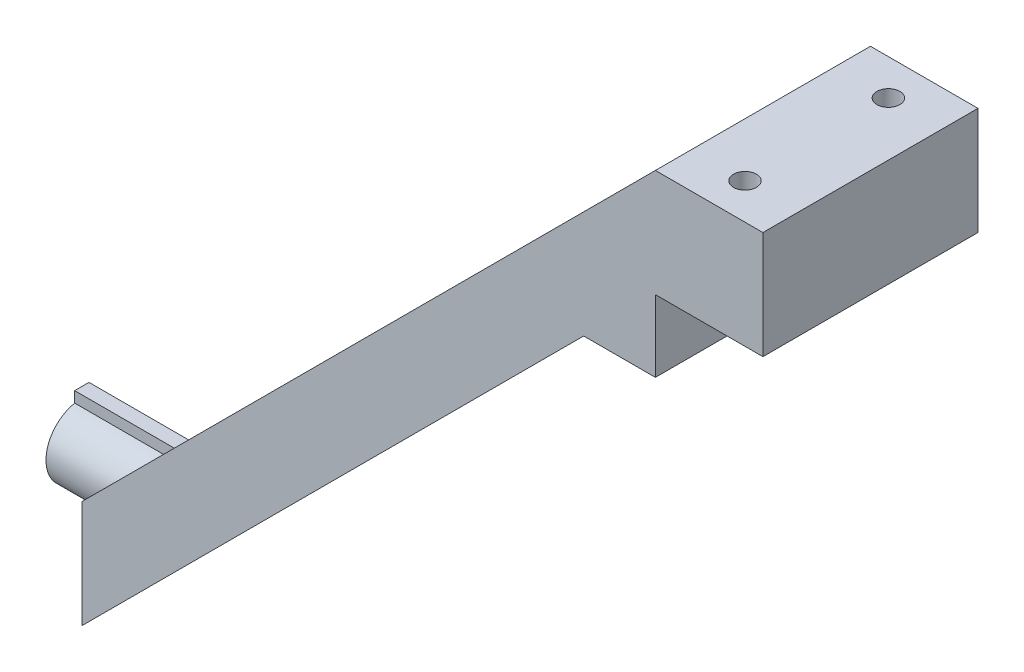
ISO-10303-21;
HEADER;
FILE_DESCRIPTION(('STEP AP214'),'2;1');
FILE_NAME('part.step','',(''),(''),'','','');
FILE_SCHEMA(('AUTOMOTIVE_DESIGN { 1 0 10303 214 1 1 1 1 }'));
ENDSEC;
DATA;
#1=APPLICATION_CONTEXT('core data for automotive mechanical design processes');
#2=APPLICATION_PROTOCOL_DEFINITION('international standard','automotive_design',2000,#1);
#3=PRODUCT_CONTEXT('',#1,'mechanical');
#4=PRODUCT('Part','Part','',(#3));
#5=PRODUCT_RELATED_PRODUCT_CATEGORY('part','',(#4));
#6=PRODUCT_DEFINITION_FORMATION('','',#4);
#7=PRODUCT_DEFINITION_CONTEXT('part definition',#1,'design');
#8=PRODUCT_DEFINITION('design','',#6,#7);
#9=PRODUCT_DEFINITION_SHAPE('','',#8);
#10=(LENGTH_UNIT() NAMED_UNIT(*) SI_UNIT(.MILLI.,.METRE.));
#11=(NAMED_UNIT(*) PLANE_ANGLE_UNIT() SI_UNIT($,.RADIAN.));
#12=(NAMED_UNIT(*) SI_UNIT($,.STERADIAN.) SOLID_ANGLE_UNIT());
#13=UNCERTAINTY_MEASURE_WITH_UNIT(LENGTH_MEASURE(1.E-05),#10,'distance_accuracy_value','');
#14=(GEOMETRIC_REPRESENTATION_CONTEXT(3) GLOBAL_UNCERTAINTY_ASSIGNED_CONTEXT((#13)) GLOBAL_UNIT_ASSIGNED_CONTEXT((#10,
#11,#12)) REPRESENTATION_CONTEXT('',''));
#15=CARTESIAN_POINT('',(0.,0.,0.));
#16=DIRECTION('',(0.,0.,1.));
#17=DIRECTION('',(1.,0.,0.));
#18=AXIS2_PLACEMENT_3D('',#15,#16,#17);
#19=CARTESIAN_POINT('',(-79.9999999999997,-80.,30.));
#20=DIRECTION('',(1.,0.,0.));
#21=DIRECTION('',(0.,0.,-1.));
#22=AXIS2_PLACEMENT_3D('',#19,#20,#21);
#23=PLANE('',#22);
#24=DIRECTION('',(0.,-1.,0.));
#25=VECTOR('',#24,1.);
#26=CARTESIAN_POINT('',(-79.9999999999997,-80.,0.));
#27=LINE('',#26,#25);
#28=CARTESIAN_POINT('',(-79.9999999999997,-80.,0.));
#29=VERTEX_POINT('',#28);
#30=CARTESIAN_POINT('',(-79.9999999999997,-95.,0.));
#31=VERTEX_POINT('',#30);
#32=EDGE_CURVE('E206',#29,#31,#27,.T.);
#33=ORIENTED_EDGE('',*,*,#32,.T.);
#34=DIRECTION('',(0.,0.,-1.));
#35=VECTOR('',#34,1.);
#36=CARTESIAN_POINT('',(-79.9999999999997,-95.,30.));
#37=LINE('',#36,#35);
#38=CARTESIAN_POINT('',(-79.9999999999997,-95.,30.));
#39=VERTEX_POINT('',#38);
#40=EDGE_CURVE('E55',#39,#31,#37,.T.);
#41=ORIENTED_EDGE('',*,*,#40,.F.);
#42=DIRECTION('',(0.,-1.,0.));
#43=VECTOR('',#42,1.);
#44=CARTESIAN_POINT('',(-79.9999999999997,-80.,30.));
#45=LINE('',#44,#43);
#46=CARTESIAN_POINT('',(-79.9999999999997,-80.,30.));
#47=VERTEX_POINT('',#46);
#48=EDGE_CURVE('E179',#47,#39,#45,.T.);
#49=ORIENTED_EDGE('',*,*,#48,.F.);
#50=DIRECTION('',(0.,0.,-1.));
#51=VECTOR('',#50,1.);
#52=CARTESIAN_POINT('',(-79.9999999999997,-80.,30.));
#53=LINE('',#52,#51);
#54=EDGE_CURVE('E11',#47,#29,#53,.T.);
#55=ORIENTED_EDGE('',*,*,#54,.T.);
#56=EDGE_LOOP('',(#33,#41,#49,#55));
#57=FACE_BOUND('',#56,.T.);
#58=CARTESIAN_POINT('',(-79.9999999999997,-87.5,15.));
#59=DIRECTION('',(-1.,0.,0.));
#60=DIRECTION('',(0.,0.,1.));
#61=AXIS2_PLACEMENT_3D('',#58,#59,#60);
#62=CIRCLE('',#61,5.00000000000001);
#63=CARTESIAN_POINT('',(-79.9999999999997,-82.6010205144336,14.));
#64=VERTEX_POINT('',#63);
#65=CARTESIAN_POINT('',(-79.9999999999997,-82.6010205144336,16.));
#66=VERTEX_POINT('',#65);
#67=EDGE_CURVE('E63',#64,#66,#62,.T.);
#68=ORIENTED_EDGE('',*,*,#67,.F.);
#69=DIRECTION('',(0.,-1.,0.));
#70=VECTOR('',#69,1.);
#71=CARTESIAN_POINT('',(-79.9999999999997,-82.6010205144336,14.));
#72=LINE('',#71,#70);
#73=CARTESIAN_POINT('',(-79.9999999999997,-81.1010205144337,14.));
#74=VERTEX_POINT('',#73);
#75=EDGE_CURVE('E67',#74,#64,#72,.T.);
#76=ORIENTED_EDGE('',*,*,#75,.F.);
#77=DIRECTION('',(0.,0.,-1.));
#78=VECTOR('',#77,1.);
#79=CARTESIAN_POINT('',(-79.9999999999997,-81.1010205144337,14.));
#80=LINE('',#79,#78);
#81=CARTESIAN_POINT('',(-79.9999999999997,-81.1010205144337,16.));
#82=VERTEX_POINT('',#81);
#83=EDGE_CURVE('E416',#82,#74,#80,.T.);
#84=ORIENTED_EDGE('',*,*,#83,.F.);
#85=DIRECTION('',(0.,1.,0.));
#86=VECTOR('',#85,1.);
#87=CARTESIAN_POINT('',(-79.9999999999997,-82.6010205144336,16.));
#88=LINE('',#87,#86);
#89=EDGE_CURVE('E426',#66,#82,#88,.T.);
#90=ORIENTED_EDGE('',*,*,#89,.F.);
#91=EDGE_LOOP('',(#68,#76,#84,#90));
#92=FACE_BOUND('',#91,.T.);
#93=ADVANCED_FACE('F45',(#57,#92),#23,.F.);
#94=CARTESIAN_POINT('',(0.,0.,30.));
#95=DIRECTION('',(0.707106781186549,-0.707106781186546,0.));
#96=DIRECTION('',(0.707106781186546,0.707106781186549,0.));
#97=AXIS2_PLACEMENT_3D('',#94,#95,#96);
#98=PLANE('',#97);
#99=DIRECTION('',(-0.707106781186546,-0.707106781186549,0.));
#100=VECTOR('',#99,1.);
#101=CARTESIAN_POINT('',(0.,0.,0.));
#102=LINE('',#101,#100);
#103=CARTESIAN_POINT('',(0.,0.,0.));
#104=VERTEX_POINT('',#103);
#105=EDGE_CURVE('E202',#104,#29,#102,.T.);
#106=ORIENTED_EDGE('',*,*,#105,.T.);
#107=ORIENTED_EDGE('',*,*,#54,.F.);
#108=DIRECTION('',(-0.707106781186546,-0.707106781186549,0.));
#109=VECTOR('',#108,1.);
#110=CARTESIAN_POINT('',(0.,0.,30.));
#111=LINE('',#110,#109);
#112=CARTESIAN_POINT('',(0.,0.,30.));
#113=VERTEX_POINT('',#112);
#114=EDGE_CURVE('E175',#113,#47,#111,.T.);
#115=ORIENTED_EDGE('',*,*,#114,.F.);
#116=DIRECTION('',(0.,0.,-1.));
#117=VECTOR('',#116,1.);
#118=CARTESIAN_POINT('',(0.,0.,30.));
#119=LINE('',#118,#117);
#120=EDGE_CURVE('E201',#113,#104,#119,.T.);
#121=ORIENTED_EDGE('',*,*,#120,.T.);
#122=EDGE_LOOP('',(#106,#107,#115,#121));
#123=FACE_BOUND('',#122,.T.);
#124=ADVANCED_FACE('F47',(#123),#98,.F.);
#125=CARTESIAN_POINT('',(-9.99999999999996,-25.,30.));
#126=DIRECTION('',(-0.707106781186549,0.707106781186546,0.));
#127=DIRECTION('',(-0.707106781186546,-0.707106781186549,0.));
#128=AXIS2_PLACEMENT_3D('',#125,#126,#127);
#129=PLANE('',#128);
#130=DIRECTION('',(0.707106781186546,0.707106781186549,0.));
#131=VECTOR('',#130,1.);
#132=CARTESIAN_POINT('',(-9.99999999999996,-25.,0.));
#133=LINE('',#132,#131);
#134=CARTESIAN_POINT('',(-9.99999999999996,-25.,0.));
#135=VERTEX_POINT('',#134);
#136=EDGE_CURVE('E209',#31,#135,#133,.T.);
#137=ORIENTED_EDGE('',*,*,#136,.T.);
#138=DIRECTION('',(0.,0.,-1.));
#139=VECTOR('',#138,1.);
#140=CARTESIAN_POINT('',(-9.99999999999996,-25.,30.));
#141=LINE('',#140,#139);
#142=CARTESIAN_POINT('',(-9.99999999999996,-25.,30.));
#143=VERTEX_POINT('',#142);
#144=EDGE_CURVE('E245',#143,#135,#141,.T.);
#145=ORIENTED_EDGE('',*,*,#144,.F.);
#146=DIRECTION('',(0.707106781186546,0.707106781186549,0.));
#147=VECTOR('',#146,1.);
#148=CARTESIAN_POINT('',(-9.99999999999996,-25.,30.));
#149=LINE('',#148,#147);
#150=EDGE_CURVE('E183',#39,#143,#149,.T.);
#151=ORIENTED_EDGE('',*,*,#150,.F.);
#152=ORIENTED_EDGE('',*,*,#40,.T.);
#153=EDGE_LOOP('',(#137,#145,#151,#152));
#154=FACE_BOUND('',#153,.T.);
#155=ADVANCED_FACE('F279',(#154),#129,.F.);
#156=CARTESIAN_POINT('',(0.,-25.,30.));
#157=DIRECTION('',(0.,1.,0.));
#158=DIRECTION('',(0.,0.,1.));
#159=AXIS2_PLACEMENT_3D('',#156,#157,#158);
#160=PLANE('',#159);
#161=DIRECTION('',(1.,0.,0.));
#162=VECTOR('',#161,1.);
#163=CARTESIAN_POINT('',(0.,-25.,0.));
#164=LINE('',#163,#162);
#165=CARTESIAN_POINT('',(0.,-25.,0.));
#166=VERTEX_POINT('',#165);
#167=EDGE_CURVE('E212',#135,#166,#164,.T.);
#168=ORIENTED_EDGE('',*,*,#167,.T.);
#169=DIRECTION('',(0.,0.,-1.));
#170=VECTOR('',#169,1.);
#171=CARTESIAN_POINT('',(0.,-25.,30.));
#172=LINE('',#171,#170);
#173=CARTESIAN_POINT('',(0.,-25.,30.));
#174=VERTEX_POINT('',#173);
#175=EDGE_CURVE('E241',#174,#166,#172,.T.);
#176=ORIENTED_EDGE('',*,*,#175,.F.);
#177=DIRECTION('',(1.,0.,0.));
#178=VECTOR('',#177,1.);
#179=CARTESIAN_POINT('',(0.,-25.,30.));
#180=LINE('',#179,#178);
#181=EDGE_CURVE('E186',#143,#174,#180,.T.);
#182=ORIENTED_EDGE('',*,*,#181,.F.);
#183=ORIENTED_EDGE('',*,*,#144,.T.);
#184=EDGE_LOOP('',(#168,#176,#182,#183));
#185=FACE_BOUND('',#184,.T.);
#186=ADVANCED_FACE('F284',(#185),#160,.F.);
#187=CARTESIAN_POINT('',(0.,-15.,30.));
#188=DIRECTION('',(-1.,0.,0.));
#189=DIRECTION('',(0.,-1.,0.));
#190=AXIS2_PLACEMENT_3D('',#187,#188,#189);
#191=PLANE('',#190);
#192=DIRECTION('',(0.,1.,0.));
#193=VECTOR('',#192,1.);
#194=CARTESIAN_POINT('',(0.,-15.,0.));
#195=LINE('',#194,#193);
#196=CARTESIAN_POINT('',(0.,-15.,0.));
#197=VERTEX_POINT('',#196);
#198=EDGE_CURVE('E215',#166,#197,#195,.T.);
#199=ORIENTED_EDGE('',*,*,#198,.T.);
#200=DIRECTION('',(0.,0.,-1.));
#201=VECTOR('',#200,1.);
#202=CARTESIAN_POINT('',(0.,-15.,30.));
#203=LINE('',#202,#201);
#204=CARTESIAN_POINT('',(0.,-15.,30.));
#205=VERTEX_POINT('',#204);
#206=EDGE_CURVE('E237',#205,#197,#203,.T.);
#207=ORIENTED_EDGE('',*,*,#206,.F.);
#208=DIRECTION('',(0.,1.,0.));
#209=VECTOR('',#208,1.);
#210=CARTESIAN_POINT('',(0.,-15.,30.));
#211=LINE('',#210,#209);
#212=EDGE_CURVE('E189',#174,#205,#211,.T.);
#213=ORIENTED_EDGE('',*,*,#212,.F.);
#214=ORIENTED_EDGE('',*,*,#175,.T.);
#215=EDGE_LOOP('',(#199,#207,#213,#214));
#216=FACE_BOUND('',#215,.T.);
#217=ADVANCED_FACE('F288',(#216),#191,.F.);
#218=CARTESIAN_POINT('',(15.,-15.,30.));
#219=DIRECTION('',(0.,1.,0.));
#220=DIRECTION('',(-1.,0.,0.));
#221=AXIS2_PLACEMENT_3D('',#218,#219,#220);
#222=PLANE('',#221);
#223=CARTESIAN_POINT('',(7.5,-15.,5.));
#224=DIRECTION('',(0.,1.,0.));
#225=DIRECTION('',(-1.,0.,0.));
#226=AXIS2_PLACEMENT_3D('',#223,#224,#225);
#227=CIRCLE('',#226,1.6);
#228=CARTESIAN_POINT('',(5.9,-15.,5.));
#229=VERTEX_POINT('',#228);
#230=EDGE_CURVE('E165',#229,#229,#227,.F.);
#231=ORIENTED_EDGE('',*,*,#230,.F.);
#232=EDGE_LOOP('',(#231));
#233=FACE_BOUND('',#232,.T.);
#234=CARTESIAN_POINT('',(7.5,-15.,25.));
#235=DIRECTION('',(0.,1.,0.));
#236=DIRECTION('',(-1.,0.,0.));
#237=AXIS2_PLACEMENT_3D('',#234,#235,#236);
#238=CIRCLE('',#237,1.6);
#239=CARTESIAN_POINT('',(5.9,-15.,25.));
#240=VERTEX_POINT('',#239);
#241=EDGE_CURVE('E160',#240,#240,#238,.F.);
#242=ORIENTED_EDGE('',*,*,#241,.F.);
#243=EDGE_LOOP('',(#242));
#244=FACE_BOUND('',#243,.T.);
#245=DIRECTION('',(1.,0.,0.));
#246=VECTOR('',#245,1.);
#247=CARTESIAN_POINT('',(15.,-15.,0.));
#248=LINE('',#247,#246);
#249=CARTESIAN_POINT('',(15.,-15.,0.));
#250=VERTEX_POINT('',#249);
#251=EDGE_CURVE('E218',#197,#250,#248,.T.);
#252=ORIENTED_EDGE('',*,*,#251,.T.);
#253=DIRECTION('',(0.,0.,-1.));
#254=VECTOR('',#253,1.);
#255=CARTESIAN_POINT('',(15.,-15.,30.));
#256=LINE('',#255,#254);
#257=CARTESIAN_POINT('',(15.,-15.,30.));
#258=VERTEX_POINT('',#257);
#259=EDGE_CURVE('E233',#258,#250,#256,.T.);
#260=ORIENTED_EDGE('',*,*,#259,.F.);
#261=DIRECTION('',(1.,0.,0.));
#262=VECTOR('',#261,1.);
#263=CARTESIAN_POINT('',(15.,-15.,30.));
#264=LINE('',#263,#262);
#265=EDGE_CURVE('E192',#205,#258,#264,.T.);
#266=ORIENTED_EDGE('',*,*,#265,.F.);
#267=ORIENTED_EDGE('',*,*,#206,.T.);
#268=EDGE_LOOP('',(#252,#260,#266,#267));
#269=FACE_BOUND('',#268,.T.);
#270=ADVANCED_FACE('F292',(#233,#244,#269),#222,.F.);
#271=CARTESIAN_POINT('',(15.,0.,30.));
#272=DIRECTION('',(-1.,0.,0.));
#273=DIRECTION('',(0.,-1.,0.));
#274=AXIS2_PLACEMENT_3D('',#271,#272,#273);
#275=PLANE('',#274);
#276=DIRECTION('',(0.,1.,0.));
#277=VECTOR('',#276,1.);
#278=CARTESIAN_POINT('',(15.,0.,0.));
#279=LINE('',#278,#277);
#280=CARTESIAN_POINT('',(15.,0.,0.));
#281=VERTEX_POINT('',#280);
#282=EDGE_CURVE('E221',#250,#281,#279,.T.);
#283=ORIENTED_EDGE('',*,*,#282,.T.);
#284=DIRECTION('',(0.,0.,-1.));
#285=VECTOR('',#284,1.);
#286=CARTESIAN_POINT('',(15.,0.,30.));
#287=LINE('',#286,#285);
#288=CARTESIAN_POINT('',(15.,0.,30.));
#289=VERTEX_POINT('',#288);
#290=EDGE_CURVE('E229',#289,#281,#287,.T.);
#291=ORIENTED_EDGE('',*,*,#290,.F.);
#292=DIRECTION('',(0.,1.,0.));
#293=VECTOR('',#292,1.);
#294=CARTESIAN_POINT('',(15.,0.,30.));
#295=LINE('',#294,#293);
#296=EDGE_CURVE('E195',#258,#289,#295,.T.);
#297=ORIENTED_EDGE('',*,*,#296,.F.);
#298=ORIENTED_EDGE('',*,*,#259,.T.);
#299=EDGE_LOOP('',(#283,#291,#297,#298));
#300=FACE_BOUND('',#299,.T.);
#301=ADVANCED_FACE('F296',(#300),#275,.F.);
#302=CARTESIAN_POINT('',(0.,0.,30.));
#303=DIRECTION('',(0.,-1.,0.));
#304=DIRECTION('',(0.,0.,-1.));
#305=AXIS2_PLACEMENT_3D('',#302,#303,#304);
#306=PLANE('',#305);
#307=CARTESIAN_POINT('',(7.5,0.,5.));
#308=DIRECTION('',(0.,-1.,0.));
#309=DIRECTION('',(0.,0.,-1.));
#310=AXIS2_PLACEMENT_3D('',#307,#308,#309);
#311=CIRCLE('',#310,1.6);
#312=CARTESIAN_POINT('',(7.5,0.,3.4));
#313=VERTEX_POINT('',#312);
#314=EDGE_CURVE('E49',#313,#313,#311,.T.);
#315=ORIENTED_EDGE('',*,*,#314,.T.);
#316=EDGE_LOOP('',(#315));
#317=FACE_BOUND('',#316,.T.);
#318=CARTESIAN_POINT('',(7.5,0.,25.));
#319=DIRECTION('',(0.,-1.,0.));
#320=DIRECTION('',(0.,0.,-1.));
#321=AXIS2_PLACEMENT_3D('',#318,#319,#320);
#322=CIRCLE('',#321,1.6);
#323=CARTESIAN_POINT('',(7.5,0.,23.4));
#324=VERTEX_POINT('',#323);
#325=EDGE_CURVE('E173',#324,#324,#322,.T.);
#326=ORIENTED_EDGE('',*,*,#325,.T.);
#327=EDGE_LOOP('',(#326));
#328=FACE_BOUND('',#327,.T.);
#329=DIRECTION('',(-1.,0.,0.));
#330=VECTOR('',#329,1.);
#331=CARTESIAN_POINT('',(0.,0.,0.));
#332=LINE('',#331,#330);
#333=EDGE_CURVE('E180',#281,#104,#332,.T.);
#334=ORIENTED_EDGE('',*,*,#333,.T.);
#335=ORIENTED_EDGE('',*,*,#120,.F.);
#336=DIRECTION('',(-1.,0.,0.));
#337=VECTOR('',#336,1.);
#338=CARTESIAN_POINT('',(0.,0.,30.));
#339=LINE('',#338,#337);
#340=EDGE_CURVE('E198',#289,#113,#339,.T.);
#341=ORIENTED_EDGE('',*,*,#340,.F.);
#342=ORIENTED_EDGE('',*,*,#290,.T.);
#343=EDGE_LOOP('',(#334,#335,#341,#342));
#344=FACE_BOUND('',#343,.T.);
#345=ADVANCED_FACE('F259',(#317,#328,#344),#306,.F.);
#346=CARTESIAN_POINT('',(0.,0.,30.));
#347=DIRECTION('',(0.,0.,1.));
#348=DIRECTION('',(1.,0.,0.));
#349=AXIS2_PLACEMENT_3D('',#346,#347,#348);
#350=PLANE('',#349);
#351=ORIENTED_EDGE('',*,*,#114,.T.);
#352=ORIENTED_EDGE('',*,*,#48,.T.);
#353=ORIENTED_EDGE('',*,*,#150,.T.);
#354=ORIENTED_EDGE('',*,*,#181,.T.);
#355=ORIENTED_EDGE('',*,*,#212,.T.);
#356=ORIENTED_EDGE('',*,*,#265,.T.);
#357=ORIENTED_EDGE('',*,*,#296,.T.);
#358=ORIENTED_EDGE('',*,*,#340,.T.);
#359=EDGE_LOOP('',(#351,#352,#353,#354,#355,#356,#357,#358));
#360=FACE_BOUND('',#359,.T.);
#361=ADVANCED_FACE('F303',(#360),#350,.T.);
#362=CARTESIAN_POINT('',(0.,0.,0.));
#363=DIRECTION('',(0.,0.,1.));
#364=DIRECTION('',(1.,0.,0.));
#365=AXIS2_PLACEMENT_3D('',#362,#363,#364);
#366=PLANE('',#365);
#367=ORIENTED_EDGE('',*,*,#105,.F.);
#368=ORIENTED_EDGE('',*,*,#333,.F.);
#369=ORIENTED_EDGE('',*,*,#282,.F.);
#370=ORIENTED_EDGE('',*,*,#251,.F.);
#371=ORIENTED_EDGE('',*,*,#198,.F.);
#372=ORIENTED_EDGE('',*,*,#167,.F.);
#373=ORIENTED_EDGE('',*,*,#136,.F.);
#374=ORIENTED_EDGE('',*,*,#32,.F.);
#375=EDGE_LOOP('',(#367,#368,#369,#370,#371,#372,#373,#374));
#376=FACE_BOUND('',#375,.T.);
#377=ADVANCED_FACE('F272',(#376),#366,.F.);
#378=CARTESIAN_POINT('',(7.5,-19.5254833995939,25.));
#379=DIRECTION('',(0.,1.,0.));
#380=DIRECTION('',(0.,0.,1.));
#381=AXIS2_PLACEMENT_3D('',#378,#379,#380);
#382=CYLINDRICAL_SURFACE('',#381,1.6);
#383=ORIENTED_EDGE('',*,*,#241,.T.);
#384=EDGE_LOOP('',(#383));
#385=FACE_BOUND('',#384,.T.);
#386=ORIENTED_EDGE('',*,*,#325,.F.);
#387=EDGE_LOOP('',(#386));
#388=FACE_BOUND('',#387,.T.);
#389=ADVANCED_FACE('F263',(#385,#388),#382,.F.);
#390=CARTESIAN_POINT('',(7.5,-19.5254833995939,5.));
#391=DIRECTION('',(0.,1.,0.));
#392=DIRECTION('',(0.,0.,1.));
#393=AXIS2_PLACEMENT_3D('',#390,#391,#392);
#394=CYLINDRICAL_SURFACE('',#393,1.6);
#395=ORIENTED_EDGE('',*,*,#230,.T.);
#396=EDGE_LOOP('',(#395));
#397=FACE_BOUND('',#396,.T.);
#398=ORIENTED_EDGE('',*,*,#314,.F.);
#399=EDGE_LOOP('',(#398));
#400=FACE_BOUND('',#399,.T.);
#401=ADVANCED_FACE('F261',(#397,#400),#394,.F.);
#402=CARTESIAN_POINT('',(-94.9999999999997,-87.5,15.));
#403=DIRECTION('',(1.,0.,0.));
#404=DIRECTION('',(0.,0.,-1.));
#405=AXIS2_PLACEMENT_3D('',#402,#403,#404);
#406=CYLINDRICAL_SURFACE('',#405,5.00000000000001);
#407=ORIENTED_EDGE('',*,*,#67,.T.);
#408=DIRECTION('',(1.,0.,0.));
#409=VECTOR('',#408,1.);
#410=CARTESIAN_POINT('',(-94.9999999999997,-82.6010205144336,16.));
#411=LINE('',#410,#409);
#412=CARTESIAN_POINT('',(-94.9999999999997,-82.6010205144336,16.));
#413=VERTEX_POINT('',#412);
#414=EDGE_CURVE('E140',#413,#66,#411,.T.);
#415=ORIENTED_EDGE('',*,*,#414,.F.);
#416=CARTESIAN_POINT('',(-94.9999999999997,-87.5,15.));
#417=DIRECTION('',(-1.,0.,0.));
#418=DIRECTION('',(0.,0.,1.));
#419=AXIS2_PLACEMENT_3D('',#416,#417,#418);
#420=CIRCLE('',#419,5.00000000000001);
#421=CARTESIAN_POINT('',(-94.9999999999997,-82.6010205144336,14.));
#422=VERTEX_POINT('',#421);
#423=EDGE_CURVE('E147',#422,#413,#420,.T.);
#424=ORIENTED_EDGE('',*,*,#423,.F.);
#425=DIRECTION('',(1.,0.,0.));
#426=VECTOR('',#425,1.);
#427=CARTESIAN_POINT('',(-94.9999999999997,-82.6010205144336,14.));
#428=LINE('',#427,#426);
#429=EDGE_CURVE('E413',#422,#64,#428,.T.);
#430=ORIENTED_EDGE('',*,*,#429,.T.);
#431=EDGE_LOOP('',(#407,#415,#424,#430));
#432=FACE_BOUND('',#431,.T.);
#433=ADVANCED_FACE('F158',(#432),#406,.T.);
#434=CARTESIAN_POINT('',(-94.9999999999997,-82.6010205144336,16.));
#435=DIRECTION('',(0.,0.,-1.));
#436=DIRECTION('',(-1.,0.,0.));
#437=AXIS2_PLACEMENT_3D('',#434,#435,#436);
#438=PLANE('',#437);
#439=ORIENTED_EDGE('',*,*,#89,.T.);
#440=DIRECTION('',(1.,0.,0.));
#441=VECTOR('',#440,1.);
#442=CARTESIAN_POINT('',(-94.9999999999997,-81.1010205144337,16.));
#443=LINE('',#442,#441);
#444=CARTESIAN_POINT('',(-94.9999999999997,-81.1010205144337,16.));
#445=VERTEX_POINT('',#444);
#446=EDGE_CURVE('E142',#445,#82,#443,.T.);
#447=ORIENTED_EDGE('',*,*,#446,.F.);
#448=DIRECTION('',(0.,1.,0.));
#449=VECTOR('',#448,1.);
#450=CARTESIAN_POINT('',(-94.9999999999997,-82.6010205144336,16.));
#451=LINE('',#450,#449);
#452=EDGE_CURVE('E135',#413,#445,#451,.T.);
#453=ORIENTED_EDGE('',*,*,#452,.F.);
#454=ORIENTED_EDGE('',*,*,#414,.T.);
#455=EDGE_LOOP('',(#439,#447,#453,#454));
#456=FACE_BOUND('',#455,.T.);
#457=ADVANCED_FACE('F138',(#456),#438,.F.);
#458=CARTESIAN_POINT('',(-94.9999999999997,-81.1010205144337,14.));
#459=DIRECTION('',(0.,-1.,0.));
#460=DIRECTION('',(0.,0.,-1.));
#461=AXIS2_PLACEMENT_3D('',#458,#459,#460);
#462=PLANE('',#461);
#463=ORIENTED_EDGE('',*,*,#83,.T.);
#464=DIRECTION('',(1.,0.,0.));
#465=VECTOR('',#464,1.);
#466=CARTESIAN_POINT('',(-94.9999999999997,-81.1010205144337,14.));
#467=LINE('',#466,#465);
#468=CARTESIAN_POINT('',(-94.9999999999997,-81.1010205144337,14.));
#469=VERTEX_POINT('',#468);
#470=EDGE_CURVE('E167',#469,#74,#467,.T.);
#471=ORIENTED_EDGE('',*,*,#470,.F.);
#472=DIRECTION('',(0.,0.,-1.));
#473=VECTOR('',#472,1.);
#474=CARTESIAN_POINT('',(-94.9999999999997,-81.1010205144337,14.));
#475=LINE('',#474,#473);
#476=EDGE_CURVE('E146',#445,#469,#475,.T.);
#477=ORIENTED_EDGE('',*,*,#476,.F.);
#478=ORIENTED_EDGE('',*,*,#446,.T.);
#479=EDGE_LOOP('',(#463,#471,#477,#478));
#480=FACE_BOUND('',#479,.T.);
#481=ADVANCED_FACE('F382',(#480),#462,.F.);
#482=CARTESIAN_POINT('',(-94.9999999999997,-82.6010205144336,14.));
#483=DIRECTION('',(0.,0.,1.));
#484=DIRECTION('',(0.,-1.,0.));
#485=AXIS2_PLACEMENT_3D('',#482,#483,#484);
#486=PLANE('',#485);
#487=ORIENTED_EDGE('',*,*,#75,.T.);
#488=ORIENTED_EDGE('',*,*,#429,.F.);
#489=DIRECTION('',(0.,-1.,0.));
#490=VECTOR('',#489,1.);
#491=CARTESIAN_POINT('',(-94.9999999999997,-82.6010205144336,14.));
#492=LINE('',#491,#490);
#493=EDGE_CURVE('E152',#469,#422,#492,.T.);
#494=ORIENTED_EDGE('',*,*,#493,.F.);
#495=ORIENTED_EDGE('',*,*,#470,.T.);
#496=EDGE_LOOP('',(#487,#488,#494,#495));
#497=FACE_BOUND('',#496,.T.);
#498=ADVANCED_FACE('F391',(#497),#486,.F.);
#499=CARTESIAN_POINT('',(-94.9999999999997,-87.5,15.));
#500=DIRECTION('',(-1.,0.,0.));
#501=DIRECTION('',(0.,0.,1.));
#502=AXIS2_PLACEMENT_3D('',#499,#500,#501);
#503=PLANE('',#502);
#504=ORIENTED_EDGE('',*,*,#423,.T.);
#505=ORIENTED_EDGE('',*,*,#452,.T.);
#506=ORIENTED_EDGE('',*,*,#476,.T.);
#507=ORIENTED_EDGE('',*,*,#493,.T.);
#508=EDGE_LOOP('',(#504,#505,#506,#507));
#509=FACE_BOUND('',#508,.T.);
#510=ADVANCED_FACE('F150',(#509),#503,.T.);
#511=CLOSED_SHELL('',(#93,#124,#155,#186,#217,#270,#301,#345,#361,#377,#389,#401,#433,#457,#481,
#498,#510));
#512=MANIFOLD_SOLID_BREP('B2',#511);
#513=ADVANCED_BREP_SHAPE_REPRESENTATION('',(#18,#512),#14);
#514=SHAPE_DEFINITION_REPRESENTATION(#9,#513);
ENDSEC;
END-ISO-10303-21;
